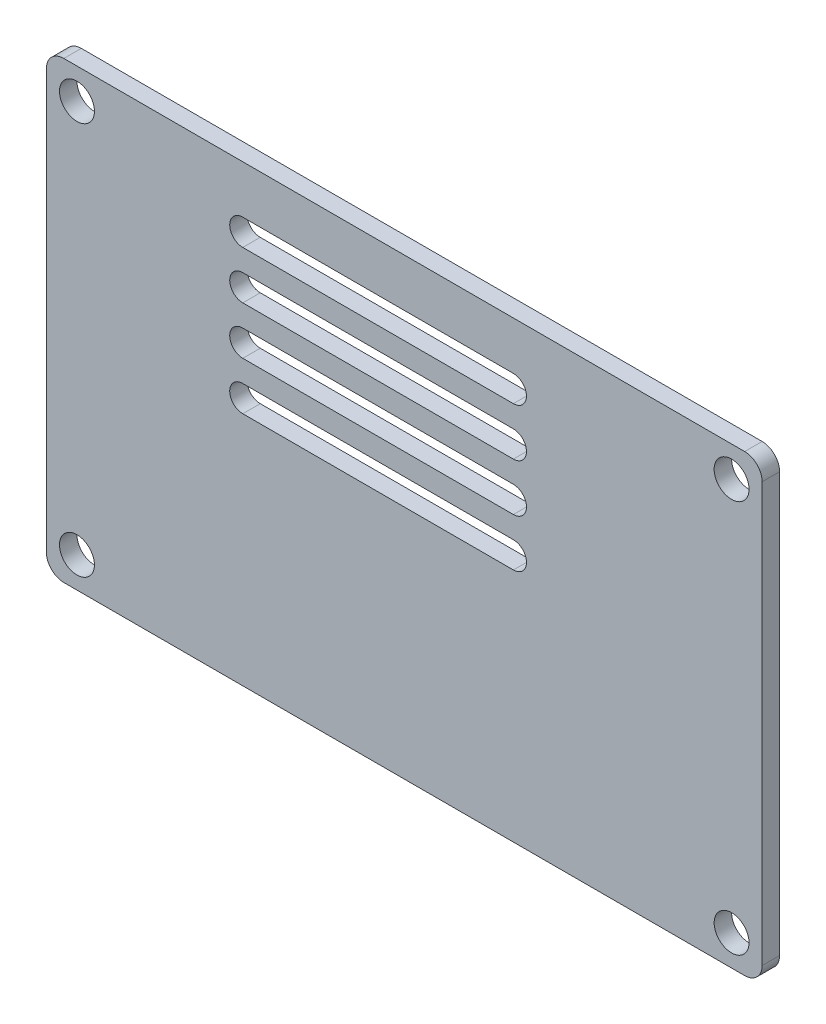
ISO-10303-21;
HEADER;
FILE_DESCRIPTION(('STEP AP214'),'2;1');
FILE_NAME('part.step','',(''),(''),'','','');
FILE_SCHEMA(('AUTOMOTIVE_DESIGN { 1 0 10303 214 1 1 1 1 }'));
ENDSEC;
DATA;
#1=APPLICATION_CONTEXT('core data for automotive mechanical design processes');
#2=APPLICATION_PROTOCOL_DEFINITION('international standard','automotive_design',2000,#1);
#3=PRODUCT_CONTEXT('',#1,'mechanical');
#4=PRODUCT('Part','Part','',(#3));
#5=PRODUCT_RELATED_PRODUCT_CATEGORY('part','',(#4));
#6=PRODUCT_DEFINITION_FORMATION('','',#4);
#7=PRODUCT_DEFINITION_CONTEXT('part definition',#1,'design');
#8=PRODUCT_DEFINITION('design','',#6,#7);
#9=PRODUCT_DEFINITION_SHAPE('','',#8);
#10=(LENGTH_UNIT() NAMED_UNIT(*) SI_UNIT(.MILLI.,.METRE.));
#11=(NAMED_UNIT(*) PLANE_ANGLE_UNIT() SI_UNIT($,.RADIAN.));
#12=(NAMED_UNIT(*) SI_UNIT($,.STERADIAN.) SOLID_ANGLE_UNIT());
#13=UNCERTAINTY_MEASURE_WITH_UNIT(LENGTH_MEASURE(1.E-05),#10,'distance_accuracy_value','');
#14=(GEOMETRIC_REPRESENTATION_CONTEXT(3) GLOBAL_UNCERTAINTY_ASSIGNED_CONTEXT((#13)) GLOBAL_UNIT_ASSIGNED_CONTEXT((#10,
#11,#12)) REPRESENTATION_CONTEXT('',''));
#15=CARTESIAN_POINT('',(0.,0.,0.));
#16=DIRECTION('',(0.,0.,1.));
#17=DIRECTION('',(1.,0.,0.));
#18=AXIS2_PLACEMENT_3D('',#15,#16,#17);
#19=CARTESIAN_POINT('',(-41.,-26.,2.));
#20=DIRECTION('',(1.,0.,0.));
#21=DIRECTION('',(0.,0.,-1.));
#22=AXIS2_PLACEMENT_3D('',#19,#20,#21);
#23=PLANE('',#22);
#24=DIRECTION('',(0.,-1.,0.));
#25=VECTOR('',#24,1.);
#26=CARTESIAN_POINT('',(-41.,-26.,0.));
#27=LINE('',#26,#25);
#28=CARTESIAN_POINT('',(-41.,24.,0.));
#29=VERTEX_POINT('',#28);
#30=CARTESIAN_POINT('',(-41.,-24.,0.));
#31=VERTEX_POINT('',#30);
#32=EDGE_CURVE('E323',#29,#31,#27,.T.);
#33=ORIENTED_EDGE('',*,*,#32,.T.);
#34=DIRECTION('',(0.,0.,-1.));
#35=VECTOR('',#34,1.);
#36=CARTESIAN_POINT('',(-41.,-24.,2.));
#37=LINE('',#36,#35);
#38=CARTESIAN_POINT('',(-41.,-24.,2.));
#39=VERTEX_POINT('',#38);
#40=EDGE_CURVE('E382',#31,#39,#37,.F.);
#41=ORIENTED_EDGE('',*,*,#40,.T.);
#42=DIRECTION('',(0.,-1.,0.));
#43=VECTOR('',#42,1.);
#44=CARTESIAN_POINT('',(-41.,-26.,2.));
#45=LINE('',#44,#43);
#46=CARTESIAN_POINT('',(-41.,24.,2.));
#47=VERTEX_POINT('',#46);
#48=EDGE_CURVE('E330',#47,#39,#45,.T.);
#49=ORIENTED_EDGE('',*,*,#48,.F.);
#50=DIRECTION('',(0.,0.,-1.));
#51=VECTOR('',#50,1.);
#52=CARTESIAN_POINT('',(-41.,24.,2.));
#53=LINE('',#52,#51);
#54=EDGE_CURVE('E379',#47,#29,#53,.T.);
#55=ORIENTED_EDGE('',*,*,#54,.T.);
#56=EDGE_LOOP('',(#33,#41,#49,#55));
#57=FACE_BOUND('',#56,.T.);
#58=ADVANCED_FACE('F32',(#57),#23,.F.);
#59=CARTESIAN_POINT('',(41.,-26.,2.));
#60=DIRECTION('',(0.,1.,0.));
#61=DIRECTION('',(-1.,0.,0.));
#62=AXIS2_PLACEMENT_3D('',#59,#60,#61);
#63=PLANE('',#62);
#64=DIRECTION('',(1.,0.,0.));
#65=VECTOR('',#64,1.);
#66=CARTESIAN_POINT('',(41.,-26.,0.));
#67=LINE('',#66,#65);
#68=CARTESIAN_POINT('',(-39.,-26.,0.));
#69=VERTEX_POINT('',#68);
#70=CARTESIAN_POINT('',(39.,-26.,0.));
#71=VERTEX_POINT('',#70);
#72=EDGE_CURVE('E346',#69,#71,#67,.T.);
#73=ORIENTED_EDGE('',*,*,#72,.T.);
#74=DIRECTION('',(0.,0.,-1.));
#75=VECTOR('',#74,1.);
#76=CARTESIAN_POINT('',(39.,-26.,2.));
#77=LINE('',#76,#75);
#78=CARTESIAN_POINT('',(39.,-26.,2.));
#79=VERTEX_POINT('',#78);
#80=EDGE_CURVE('E369',#71,#79,#77,.F.);
#81=ORIENTED_EDGE('',*,*,#80,.T.);
#82=DIRECTION('',(1.,0.,0.));
#83=VECTOR('',#82,1.);
#84=CARTESIAN_POINT('',(41.,-26.,2.));
#85=LINE('',#84,#83);
#86=CARTESIAN_POINT('',(-39.,-26.,2.));
#87=VERTEX_POINT('',#86);
#88=EDGE_CURVE('E333',#87,#79,#85,.T.);
#89=ORIENTED_EDGE('',*,*,#88,.F.);
#90=DIRECTION('',(0.,0.,-1.));
#91=VECTOR('',#90,1.);
#92=CARTESIAN_POINT('',(-39.,-26.,2.));
#93=LINE('',#92,#91);
#94=EDGE_CURVE('E366',#87,#69,#93,.T.);
#95=ORIENTED_EDGE('',*,*,#94,.T.);
#96=EDGE_LOOP('',(#73,#81,#89,#95));
#97=FACE_BOUND('',#96,.T.);
#98=ADVANCED_FACE('F411',(#97),#63,.F.);
#99=CARTESIAN_POINT('',(41.,-26.,2.));
#100=DIRECTION('',(-1.,0.,0.));
#101=DIRECTION('',(0.,0.,1.));
#102=AXIS2_PLACEMENT_3D('',#99,#100,#101);
#103=PLANE('',#102);
#104=DIRECTION('',(0.,1.,0.));
#105=VECTOR('',#104,1.);
#106=CARTESIAN_POINT('',(41.,-26.,2.));
#107=LINE('',#106,#105);
#108=CARTESIAN_POINT('',(41.,-24.,2.));
#109=VERTEX_POINT('',#108);
#110=CARTESIAN_POINT('',(41.,24.,2.));
#111=VERTEX_POINT('',#110);
#112=EDGE_CURVE('E337',#109,#111,#107,.T.);
#113=ORIENTED_EDGE('',*,*,#112,.F.);
#114=DIRECTION('',(0.,0.,-1.));
#115=VECTOR('',#114,1.);
#116=CARTESIAN_POINT('',(41.,-24.,2.));
#117=LINE('',#116,#115);
#118=CARTESIAN_POINT('',(41.,-24.,0.));
#119=VERTEX_POINT('',#118);
#120=EDGE_CURVE('E355',#109,#119,#117,.T.);
#121=ORIENTED_EDGE('',*,*,#120,.T.);
#122=DIRECTION('',(0.,1.,0.));
#123=VECTOR('',#122,1.);
#124=CARTESIAN_POINT('',(41.,-26.,0.));
#125=LINE('',#124,#123);
#126=CARTESIAN_POINT('',(41.,24.,0.));
#127=VERTEX_POINT('',#126);
#128=EDGE_CURVE('E349',#119,#127,#125,.T.);
#129=ORIENTED_EDGE('',*,*,#128,.T.);
#130=DIRECTION('',(0.,0.,-1.));
#131=VECTOR('',#130,1.);
#132=CARTESIAN_POINT('',(41.,24.,2.));
#133=LINE('',#132,#131);
#134=EDGE_CURVE('E343',#127,#111,#133,.F.);
#135=ORIENTED_EDGE('',*,*,#134,.T.);
#136=EDGE_LOOP('',(#113,#121,#129,#135));
#137=FACE_BOUND('',#136,.T.);
#138=ADVANCED_FACE('F419',(#137),#103,.F.);
#139=CARTESIAN_POINT('',(41.,26.,2.));
#140=DIRECTION('',(0.,-1.,0.));
#141=DIRECTION('',(1.,0.,0.));
#142=AXIS2_PLACEMENT_3D('',#139,#140,#141);
#143=PLANE('',#142);
#144=DIRECTION('',(-1.,0.,0.));
#145=VECTOR('',#144,1.);
#146=CARTESIAN_POINT('',(41.,26.,0.));
#147=LINE('',#146,#145);
#148=CARTESIAN_POINT('',(39.,26.,0.));
#149=VERTEX_POINT('',#148);
#150=CARTESIAN_POINT('',(-39.,26.,0.));
#151=VERTEX_POINT('',#150);
#152=EDGE_CURVE('E334',#149,#151,#147,.T.);
#153=ORIENTED_EDGE('',*,*,#152,.T.);
#154=DIRECTION('',(0.,0.,-1.));
#155=VECTOR('',#154,1.);
#156=CARTESIAN_POINT('',(-39.,26.,2.));
#157=LINE('',#156,#155);
#158=CARTESIAN_POINT('',(-39.,26.,2.));
#159=VERTEX_POINT('',#158);
#160=EDGE_CURVE('E11',#151,#159,#157,.F.);
#161=ORIENTED_EDGE('',*,*,#160,.T.);
#162=DIRECTION('',(-1.,0.,0.));
#163=VECTOR('',#162,1.);
#164=CARTESIAN_POINT('',(41.,26.,2.));
#165=LINE('',#164,#163);
#166=CARTESIAN_POINT('',(39.,26.,2.));
#167=VERTEX_POINT('',#166);
#168=EDGE_CURVE('E340',#167,#159,#165,.T.);
#169=ORIENTED_EDGE('',*,*,#168,.F.);
#170=DIRECTION('',(0.,0.,-1.));
#171=VECTOR('',#170,1.);
#172=CARTESIAN_POINT('',(39.,26.,2.));
#173=LINE('',#172,#171);
#174=EDGE_CURVE('E40',#167,#149,#173,.T.);
#175=ORIENTED_EDGE('',*,*,#174,.T.);
#176=EDGE_LOOP('',(#153,#161,#169,#175));
#177=FACE_BOUND('',#176,.T.);
#178=ADVANCED_FACE('F388',(#177),#143,.F.);
#179=CARTESIAN_POINT('',(0.,0.,2.));
#180=DIRECTION('',(0.,0.,1.));
#181=DIRECTION('',(1.,0.,0.));
#182=AXIS2_PLACEMENT_3D('',#179,#180,#181);
#183=PLANE('',#182);
#184=CARTESIAN_POINT('',(-37.5,22.5,2.));
#185=DIRECTION('',(0.,0.,1.));
#186=DIRECTION('',(1.,0.,0.));
#187=AXIS2_PLACEMENT_3D('',#184,#185,#186);
#188=CIRCLE('',#187,2.);
#189=CARTESIAN_POINT('',(-35.5,22.5,2.));
#190=VERTEX_POINT('',#189);
#191=EDGE_CURVE('E702',#190,#190,#188,.T.);
#192=ORIENTED_EDGE('',*,*,#191,.F.);
#193=EDGE_LOOP('',(#192));
#194=FACE_BOUND('',#193,.T.);
#195=CARTESIAN_POINT('',(37.5,-22.5,2.));
#196=DIRECTION('',(0.,0.,1.));
#197=DIRECTION('',(1.,0.,0.));
#198=AXIS2_PLACEMENT_3D('',#195,#196,#197);
#199=CIRCLE('',#198,2.);
#200=CARTESIAN_POINT('',(39.5,-22.5,2.));
#201=VERTEX_POINT('',#200);
#202=EDGE_CURVE('E707',#201,#201,#199,.T.);
#203=ORIENTED_EDGE('',*,*,#202,.F.);
#204=EDGE_LOOP('',(#203));
#205=FACE_BOUND('',#204,.T.);
#206=CARTESIAN_POINT('',(-37.5,-22.5,2.));
#207=DIRECTION('',(0.,0.,1.));
#208=DIRECTION('',(1.,0.,0.));
#209=AXIS2_PLACEMENT_3D('',#206,#207,#208);
#210=CIRCLE('',#209,2.);
#211=CARTESIAN_POINT('',(-35.5,-22.5,2.));
#212=VERTEX_POINT('',#211);
#213=EDGE_CURVE('E715',#212,#212,#210,.T.);
#214=ORIENTED_EDGE('',*,*,#213,.F.);
#215=EDGE_LOOP('',(#214));
#216=FACE_BOUND('',#215,.T.);
#217=CARTESIAN_POINT('',(37.5,22.5,2.));
#218=DIRECTION('',(0.,0.,1.));
#219=DIRECTION('',(1.,0.,0.));
#220=AXIS2_PLACEMENT_3D('',#217,#218,#219);
#221=CIRCLE('',#220,2.);
#222=CARTESIAN_POINT('',(39.5,22.5,2.));
#223=VERTEX_POINT('',#222);
#224=EDGE_CURVE('E219',#223,#223,#221,.T.);
#225=ORIENTED_EDGE('',*,*,#224,.F.);
#226=EDGE_LOOP('',(#225));
#227=FACE_BOUND('',#226,.T.);
#228=CARTESIAN_POINT('',(-18.4999999999999,13.5,2.));
#229=DIRECTION('',(0.,0.,1.));
#230=DIRECTION('',(1.,0.,0.));
#231=AXIS2_PLACEMENT_3D('',#228,#229,#230);
#232=CIRCLE('',#231,1.5);
#233=CARTESIAN_POINT('',(-18.4999999999999,15.,2.));
#234=VERTEX_POINT('',#233);
#235=CARTESIAN_POINT('',(-18.4999999999999,12.,2.));
#236=VERTEX_POINT('',#235);
#237=EDGE_CURVE('E47',#234,#236,#232,.T.);
#238=ORIENTED_EDGE('',*,*,#237,.F.);
#239=DIRECTION('',(-1.,0.,0.));
#240=VECTOR('',#239,1.);
#241=CARTESIAN_POINT('',(-18.4999999999999,15.,2.));
#242=LINE('',#241,#240);
#243=CARTESIAN_POINT('',(12.5000000000001,15.,2.));
#244=VERTEX_POINT('',#243);
#245=EDGE_CURVE('E213',#244,#234,#242,.T.);
#246=ORIENTED_EDGE('',*,*,#245,.F.);
#247=CARTESIAN_POINT('',(12.5000000000001,13.5,2.));
#248=DIRECTION('',(0.,0.,1.));
#249=DIRECTION('',(1.,0.,0.));
#250=AXIS2_PLACEMENT_3D('',#247,#248,#249);
#251=CIRCLE('',#250,1.5);
#252=CARTESIAN_POINT('',(12.5000000000001,12.,2.));
#253=VERTEX_POINT('',#252);
#254=EDGE_CURVE('E216',#253,#244,#251,.T.);
#255=ORIENTED_EDGE('',*,*,#254,.F.);
#256=DIRECTION('',(1.,0.,0.));
#257=VECTOR('',#256,1.);
#258=CARTESIAN_POINT('',(-18.4999999999999,12.,2.));
#259=LINE('',#258,#257);
#260=EDGE_CURVE('E225',#236,#253,#259,.T.);
#261=ORIENTED_EDGE('',*,*,#260,.F.);
#262=EDGE_LOOP('',(#238,#246,#255,#261));
#263=FACE_BOUND('',#262,.T.);
#264=CARTESIAN_POINT('',(-18.4999999999997,8.,2.));
#265=DIRECTION('',(0.,0.,1.));
#266=DIRECTION('',(1.,0.,0.));
#267=AXIS2_PLACEMENT_3D('',#264,#265,#266);
#268=CIRCLE('',#267,1.5);
#269=CARTESIAN_POINT('',(-18.4999999999997,9.49999999999999,2.));
#270=VERTEX_POINT('',#269);
#271=CARTESIAN_POINT('',(-18.4999999999997,6.5,2.));
#272=VERTEX_POINT('',#271);
#273=EDGE_CURVE('E55',#270,#272,#268,.T.);
#274=ORIENTED_EDGE('',*,*,#273,.F.);
#275=DIRECTION('',(-1.,0.,0.));
#276=VECTOR('',#275,1.);
#277=CARTESIAN_POINT('',(-18.4999999999997,9.49999999999999,2.));
#278=LINE('',#277,#276);
#279=CARTESIAN_POINT('',(12.5000000000003,9.49999999999999,2.));
#280=VERTEX_POINT('',#279);
#281=EDGE_CURVE('E240',#280,#270,#278,.T.);
#282=ORIENTED_EDGE('',*,*,#281,.F.);
#283=CARTESIAN_POINT('',(12.5000000000003,8.,2.));
#284=DIRECTION('',(0.,0.,1.));
#285=DIRECTION('',(1.,0.,0.));
#286=AXIS2_PLACEMENT_3D('',#283,#284,#285);
#287=CIRCLE('',#286,1.5);
#288=CARTESIAN_POINT('',(12.5000000000003,6.5,2.));
#289=VERTEX_POINT('',#288);
#290=EDGE_CURVE('E255',#289,#280,#287,.T.);
#291=ORIENTED_EDGE('',*,*,#290,.F.);
#292=DIRECTION('',(1.,0.,0.));
#293=VECTOR('',#292,1.);
#294=CARTESIAN_POINT('',(-18.4999999999997,6.5,2.));
#295=LINE('',#294,#293);
#296=EDGE_CURVE('E251',#272,#289,#295,.T.);
#297=ORIENTED_EDGE('',*,*,#296,.F.);
#298=EDGE_LOOP('',(#274,#282,#291,#297));
#299=FACE_BOUND('',#298,.T.);
#300=CARTESIAN_POINT('',(-18.4999999999996,2.5,2.));
#301=DIRECTION('',(0.,0.,1.));
#302=DIRECTION('',(1.,0.,0.));
#303=AXIS2_PLACEMENT_3D('',#300,#301,#302);
#304=CIRCLE('',#303,1.5);
#305=CARTESIAN_POINT('',(-18.4999999999996,3.99999999999999,2.));
#306=VERTEX_POINT('',#305);
#307=CARTESIAN_POINT('',(-18.4999999999996,0.999999999999997,2.));
#308=VERTEX_POINT('',#307);
#309=EDGE_CURVE('E280',#306,#308,#304,.T.);
#310=ORIENTED_EDGE('',*,*,#309,.F.);
#311=DIRECTION('',(-1.,0.,0.));
#312=VECTOR('',#311,1.);
#313=CARTESIAN_POINT('',(-18.4999999999996,3.99999999999999,2.));
#314=LINE('',#313,#312);
#315=CARTESIAN_POINT('',(12.5000000000004,3.99999999999999,2.));
#316=VERTEX_POINT('',#315);
#317=EDGE_CURVE('E270',#316,#306,#314,.T.);
#318=ORIENTED_EDGE('',*,*,#317,.F.);
#319=CARTESIAN_POINT('',(12.5000000000004,2.5,2.));
#320=DIRECTION('',(0.,0.,1.));
#321=DIRECTION('',(1.,0.,0.));
#322=AXIS2_PLACEMENT_3D('',#319,#320,#321);
#323=CIRCLE('',#322,1.5);
#324=CARTESIAN_POINT('',(12.5000000000004,0.999999999999997,2.));
#325=VERTEX_POINT('',#324);
#326=EDGE_CURVE('E286',#325,#316,#323,.T.);
#327=ORIENTED_EDGE('',*,*,#326,.F.);
#328=DIRECTION('',(1.,0.,0.));
#329=VECTOR('',#328,1.);
#330=CARTESIAN_POINT('',(-18.4999999999996,0.999999999999997,2.));
#331=LINE('',#330,#329);
#332=EDGE_CURVE('E282',#308,#325,#331,.T.);
#333=ORIENTED_EDGE('',*,*,#332,.F.);
#334=EDGE_LOOP('',(#310,#318,#327,#333));
#335=FACE_BOUND('',#334,.T.);
#336=CARTESIAN_POINT('',(-18.5,19.,2.));
#337=DIRECTION('',(0.,0.,1.));
#338=DIRECTION('',(1.,0.,0.));
#339=AXIS2_PLACEMENT_3D('',#336,#337,#338);
#340=CIRCLE('',#339,1.5);
#341=CARTESIAN_POINT('',(-18.5,20.5,2.));
#342=VERTEX_POINT('',#341);
#343=CARTESIAN_POINT('',(-18.5,17.5,2.));
#344=VERTEX_POINT('',#343);
#345=EDGE_CURVE('E232',#342,#344,#340,.T.);
#346=ORIENTED_EDGE('',*,*,#345,.F.);
#347=DIRECTION('',(-1.,0.,0.));
#348=VECTOR('',#347,1.);
#349=CARTESIAN_POINT('',(-18.5,20.5,2.));
#350=LINE('',#349,#348);
#351=CARTESIAN_POINT('',(12.5,20.5,2.));
#352=VERTEX_POINT('',#351);
#353=EDGE_CURVE('E302',#352,#342,#350,.T.);
#354=ORIENTED_EDGE('',*,*,#353,.F.);
#355=CARTESIAN_POINT('',(12.5,19.,2.));
#356=DIRECTION('',(0.,0.,1.));
#357=DIRECTION('',(1.,0.,0.));
#358=AXIS2_PLACEMENT_3D('',#355,#356,#357);
#359=CIRCLE('',#358,1.5);
#360=CARTESIAN_POINT('',(12.5,17.5,2.));
#361=VERTEX_POINT('',#360);
#362=EDGE_CURVE('E316',#361,#352,#359,.T.);
#363=ORIENTED_EDGE('',*,*,#362,.F.);
#364=DIRECTION('',(1.,0.,0.));
#365=VECTOR('',#364,1.);
#366=CARTESIAN_POINT('',(-18.5,17.5,2.));
#367=LINE('',#366,#365);
#368=EDGE_CURVE('E313',#344,#361,#367,.T.);
#369=ORIENTED_EDGE('',*,*,#368,.F.);
#370=EDGE_LOOP('',(#346,#354,#363,#369));
#371=FACE_BOUND('',#370,.T.);
#372=ORIENTED_EDGE('',*,*,#88,.T.);
#373=CARTESIAN_POINT('',(39.,-24.,2.));
#374=DIRECTION('',(0.,0.,1.));
#375=DIRECTION('',(1.,0.,0.));
#376=AXIS2_PLACEMENT_3D('',#373,#374,#375);
#377=CIRCLE('',#376,2.);
#378=EDGE_CURVE('E377',#79,#109,#377,.T.);
#379=ORIENTED_EDGE('',*,*,#378,.T.);
#380=ORIENTED_EDGE('',*,*,#112,.T.);
#381=CARTESIAN_POINT('',(39.,24.,2.));
#382=DIRECTION('',(0.,0.,1.));
#383=DIRECTION('',(1.,0.,0.));
#384=AXIS2_PLACEMENT_3D('',#381,#382,#383);
#385=CIRCLE('',#384,2.);
#386=EDGE_CURVE('E371',#111,#167,#385,.T.);
#387=ORIENTED_EDGE('',*,*,#386,.T.);
#388=ORIENTED_EDGE('',*,*,#168,.T.);
#389=CARTESIAN_POINT('',(-39.,24.,2.));
#390=DIRECTION('',(0.,0.,1.));
#391=DIRECTION('',(1.,0.,0.));
#392=AXIS2_PLACEMENT_3D('',#389,#390,#391);
#393=CIRCLE('',#392,2.);
#394=EDGE_CURVE('E373',#159,#47,#393,.T.);
#395=ORIENTED_EDGE('',*,*,#394,.T.);
#396=ORIENTED_EDGE('',*,*,#48,.T.);
#397=CARTESIAN_POINT('',(-39.,-24.,2.));
#398=DIRECTION('',(0.,0.,1.));
#399=DIRECTION('',(1.,0.,0.));
#400=AXIS2_PLACEMENT_3D('',#397,#398,#399);
#401=CIRCLE('',#400,2.);
#402=EDGE_CURVE('E375',#39,#87,#401,.T.);
#403=ORIENTED_EDGE('',*,*,#402,.T.);
#404=EDGE_LOOP('',(#372,#379,#380,#387,#388,#395,#396,#403));
#405=FACE_BOUND('',#404,.T.);
#406=ADVANCED_FACE('F404',(#194,#205,#216,#227,#263,#299,#335,#371,#405),#183,.T.);
#407=CARTESIAN_POINT('',(0.,0.,0.));
#408=DIRECTION('',(0.,0.,1.));
#409=DIRECTION('',(1.,0.,0.));
#410=AXIS2_PLACEMENT_3D('',#407,#408,#409);
#411=PLANE('',#410);
#412=CARTESIAN_POINT('',(-37.5,22.5,0.));
#413=DIRECTION('',(0.,0.,1.));
#414=DIRECTION('',(1.,0.,0.));
#415=AXIS2_PLACEMENT_3D('',#412,#413,#414);
#416=CIRCLE('',#415,2.);
#417=CARTESIAN_POINT('',(-35.5,22.5,0.));
#418=VERTEX_POINT('',#417);
#419=EDGE_CURVE('E699',#418,#418,#416,.T.);
#420=ORIENTED_EDGE('',*,*,#419,.T.);
#421=EDGE_LOOP('',(#420));
#422=FACE_BOUND('',#421,.T.);
#423=CARTESIAN_POINT('',(37.5,-22.5,0.));
#424=DIRECTION('',(0.,0.,1.));
#425=DIRECTION('',(1.,0.,0.));
#426=AXIS2_PLACEMENT_3D('',#423,#424,#425);
#427=CIRCLE('',#426,2.);
#428=CARTESIAN_POINT('',(39.5,-22.5,0.));
#429=VERTEX_POINT('',#428);
#430=EDGE_CURVE('E703',#429,#429,#427,.T.);
#431=ORIENTED_EDGE('',*,*,#430,.T.);
#432=EDGE_LOOP('',(#431));
#433=FACE_BOUND('',#432,.T.);
#434=CARTESIAN_POINT('',(-37.5,-22.5,0.));
#435=DIRECTION('',(0.,0.,1.));
#436=DIRECTION('',(1.,0.,0.));
#437=AXIS2_PLACEMENT_3D('',#434,#435,#436);
#438=CIRCLE('',#437,2.);
#439=CARTESIAN_POINT('',(-35.5,-22.5,0.));
#440=VERTEX_POINT('',#439);
#441=EDGE_CURVE('E712',#440,#440,#438,.T.);
#442=ORIENTED_EDGE('',*,*,#441,.T.);
#443=EDGE_LOOP('',(#442));
#444=FACE_BOUND('',#443,.T.);
#445=CARTESIAN_POINT('',(37.5,22.5,0.));
#446=DIRECTION('',(0.,0.,1.));
#447=DIRECTION('',(1.,0.,0.));
#448=AXIS2_PLACEMENT_3D('',#445,#446,#447);
#449=CIRCLE('',#448,2.);
#450=CARTESIAN_POINT('',(39.5,22.5,0.));
#451=VERTEX_POINT('',#450);
#452=EDGE_CURVE('E283',#451,#451,#449,.T.);
#453=ORIENTED_EDGE('',*,*,#452,.T.);
#454=EDGE_LOOP('',(#453));
#455=FACE_BOUND('',#454,.T.);
#456=DIRECTION('',(-1.,0.,0.));
#457=VECTOR('',#456,1.);
#458=CARTESIAN_POINT('',(-18.4999999999999,15.,0.));
#459=LINE('',#458,#457);
#460=CARTESIAN_POINT('',(12.5000000000001,15.,0.));
#461=VERTEX_POINT('',#460);
#462=CARTESIAN_POINT('',(-18.4999999999999,15.,0.));
#463=VERTEX_POINT('',#462);
#464=EDGE_CURVE('E200',#461,#463,#459,.T.);
#465=ORIENTED_EDGE('',*,*,#464,.T.);
#466=CARTESIAN_POINT('',(-18.4999999999999,13.5,0.));
#467=DIRECTION('',(0.,0.,1.));
#468=DIRECTION('',(1.,0.,0.));
#469=AXIS2_PLACEMENT_3D('',#466,#467,#468);
#470=CIRCLE('',#469,1.5);
#471=CARTESIAN_POINT('',(-18.4999999999999,12.,0.));
#472=VERTEX_POINT('',#471);
#473=EDGE_CURVE('E194',#463,#472,#470,.T.);
#474=ORIENTED_EDGE('',*,*,#473,.T.);
#475=DIRECTION('',(1.,0.,0.));
#476=VECTOR('',#475,1.);
#477=CARTESIAN_POINT('',(-18.4999999999999,12.,0.));
#478=LINE('',#477,#476);
#479=CARTESIAN_POINT('',(12.5000000000001,12.,0.));
#480=VERTEX_POINT('',#479);
#481=EDGE_CURVE('E204',#472,#480,#478,.T.);
#482=ORIENTED_EDGE('',*,*,#481,.T.);
#483=CARTESIAN_POINT('',(12.5000000000001,13.5,0.));
#484=DIRECTION('',(0.,0.,1.));
#485=DIRECTION('',(1.,0.,0.));
#486=AXIS2_PLACEMENT_3D('',#483,#484,#485);
#487=CIRCLE('',#486,1.5);
#488=EDGE_CURVE('E208',#480,#461,#487,.T.);
#489=ORIENTED_EDGE('',*,*,#488,.T.);
#490=EDGE_LOOP('',(#465,#474,#482,#489));
#491=FACE_BOUND('',#490,.T.);
#492=DIRECTION('',(-1.,0.,0.));
#493=VECTOR('',#492,1.);
#494=CARTESIAN_POINT('',(-18.4999999999997,9.49999999999999,0.));
#495=LINE('',#494,#493);
#496=CARTESIAN_POINT('',(12.5000000000003,9.49999999999999,0.));
#497=VERTEX_POINT('',#496);
#498=CARTESIAN_POINT('',(-18.4999999999997,9.49999999999999,0.));
#499=VERTEX_POINT('',#498);
#500=EDGE_CURVE('E246',#497,#499,#495,.T.);
#501=ORIENTED_EDGE('',*,*,#500,.T.);
#502=CARTESIAN_POINT('',(-18.4999999999997,8.,0.));
#503=DIRECTION('',(0.,0.,1.));
#504=DIRECTION('',(1.,0.,0.));
#505=AXIS2_PLACEMENT_3D('',#502,#503,#504);
#506=CIRCLE('',#505,1.5);
#507=CARTESIAN_POINT('',(-18.4999999999997,6.5,0.));
#508=VERTEX_POINT('',#507);
#509=EDGE_CURVE('E236',#499,#508,#506,.T.);
#510=ORIENTED_EDGE('',*,*,#509,.T.);
#511=DIRECTION('',(1.,0.,0.));
#512=VECTOR('',#511,1.);
#513=CARTESIAN_POINT('',(-18.4999999999997,6.5,0.));
#514=LINE('',#513,#512);
#515=CARTESIAN_POINT('',(12.5000000000003,6.5,0.));
#516=VERTEX_POINT('',#515);
#517=EDGE_CURVE('E239',#508,#516,#514,.T.);
#518=ORIENTED_EDGE('',*,*,#517,.T.);
#519=CARTESIAN_POINT('',(12.5000000000003,8.,0.));
#520=DIRECTION('',(0.,0.,1.));
#521=DIRECTION('',(1.,0.,0.));
#522=AXIS2_PLACEMENT_3D('',#519,#520,#521);
#523=CIRCLE('',#522,1.5);
#524=EDGE_CURVE('E243',#516,#497,#523,.T.);
#525=ORIENTED_EDGE('',*,*,#524,.T.);
#526=EDGE_LOOP('',(#501,#510,#518,#525));
#527=FACE_BOUND('',#526,.T.);
#528=DIRECTION('',(-1.,0.,0.));
#529=VECTOR('',#528,1.);
#530=CARTESIAN_POINT('',(-18.4999999999996,3.99999999999999,0.));
#531=LINE('',#530,#529);
#532=CARTESIAN_POINT('',(12.5000000000004,3.99999999999999,0.));
#533=VERTEX_POINT('',#532);
#534=CARTESIAN_POINT('',(-18.4999999999996,3.99999999999999,0.));
#535=VERTEX_POINT('',#534);
#536=EDGE_CURVE('E276',#533,#535,#531,.T.);
#537=ORIENTED_EDGE('',*,*,#536,.T.);
#538=CARTESIAN_POINT('',(-18.4999999999996,2.5,0.));
#539=DIRECTION('',(0.,0.,1.));
#540=DIRECTION('',(1.,0.,0.));
#541=AXIS2_PLACEMENT_3D('',#538,#539,#540);
#542=CIRCLE('',#541,1.5);
#543=CARTESIAN_POINT('',(-18.4999999999996,0.999999999999997,0.));
#544=VERTEX_POINT('',#543);
#545=EDGE_CURVE('E266',#535,#544,#542,.T.);
#546=ORIENTED_EDGE('',*,*,#545,.T.);
#547=DIRECTION('',(1.,0.,0.));
#548=VECTOR('',#547,1.);
#549=CARTESIAN_POINT('',(-18.4999999999996,0.999999999999997,0.));
#550=LINE('',#549,#548);
#551=CARTESIAN_POINT('',(12.5000000000004,0.999999999999997,0.));
#552=VERTEX_POINT('',#551);
#553=EDGE_CURVE('E269',#544,#552,#550,.T.);
#554=ORIENTED_EDGE('',*,*,#553,.T.);
#555=CARTESIAN_POINT('',(12.5000000000004,2.5,0.));
#556=DIRECTION('',(0.,0.,1.));
#557=DIRECTION('',(1.,0.,0.));
#558=AXIS2_PLACEMENT_3D('',#555,#556,#557);
#559=CIRCLE('',#558,1.5);
#560=EDGE_CURVE('E273',#552,#533,#559,.T.);
#561=ORIENTED_EDGE('',*,*,#560,.T.);
#562=EDGE_LOOP('',(#537,#546,#554,#561));
#563=FACE_BOUND('',#562,.T.);
#564=DIRECTION('',(-1.,0.,0.));
#565=VECTOR('',#564,1.);
#566=CARTESIAN_POINT('',(-18.5,20.5,0.));
#567=LINE('',#566,#565);
#568=CARTESIAN_POINT('',(12.5,20.5,0.));
#569=VERTEX_POINT('',#568);
#570=CARTESIAN_POINT('',(-18.5,20.5,0.));
#571=VERTEX_POINT('',#570);
#572=EDGE_CURVE('E308',#569,#571,#567,.T.);
#573=ORIENTED_EDGE('',*,*,#572,.T.);
#574=CARTESIAN_POINT('',(-18.5,19.,0.));
#575=DIRECTION('',(0.,0.,1.));
#576=DIRECTION('',(1.,0.,0.));
#577=AXIS2_PLACEMENT_3D('',#574,#575,#576);
#578=CIRCLE('',#577,1.5);
#579=CARTESIAN_POINT('',(-18.5,17.5,0.));
#580=VERTEX_POINT('',#579);
#581=EDGE_CURVE('E298',#571,#580,#578,.T.);
#582=ORIENTED_EDGE('',*,*,#581,.T.);
#583=DIRECTION('',(1.,0.,0.));
#584=VECTOR('',#583,1.);
#585=CARTESIAN_POINT('',(-18.5,17.5,0.));
#586=LINE('',#585,#584);
#587=CARTESIAN_POINT('',(12.5,17.5,0.));
#588=VERTEX_POINT('',#587);
#589=EDGE_CURVE('E301',#580,#588,#586,.T.);
#590=ORIENTED_EDGE('',*,*,#589,.T.);
#591=CARTESIAN_POINT('',(12.5,19.,0.));
#592=DIRECTION('',(0.,0.,1.));
#593=DIRECTION('',(1.,0.,0.));
#594=AXIS2_PLACEMENT_3D('',#591,#592,#593);
#595=CIRCLE('',#594,1.5);
#596=EDGE_CURVE('E305',#588,#569,#595,.T.);
#597=ORIENTED_EDGE('',*,*,#596,.T.);
#598=EDGE_LOOP('',(#573,#582,#590,#597));
#599=FACE_BOUND('',#598,.T.);
#600=ORIENTED_EDGE('',*,*,#128,.F.);
#601=CARTESIAN_POINT('',(39.,-24.,0.));
#602=DIRECTION('',(0.,0.,1.));
#603=DIRECTION('',(1.,0.,0.));
#604=AXIS2_PLACEMENT_3D('',#601,#602,#603);
#605=CIRCLE('',#604,2.);
#606=EDGE_CURVE('E364',#119,#71,#605,.F.);
#607=ORIENTED_EDGE('',*,*,#606,.T.);
#608=ORIENTED_EDGE('',*,*,#72,.F.);
#609=CARTESIAN_POINT('',(-39.,-24.,0.));
#610=DIRECTION('',(0.,0.,1.));
#611=DIRECTION('',(1.,0.,0.));
#612=AXIS2_PLACEMENT_3D('',#609,#610,#611);
#613=CIRCLE('',#612,2.);
#614=EDGE_CURVE('E362',#69,#31,#613,.F.);
#615=ORIENTED_EDGE('',*,*,#614,.T.);
#616=ORIENTED_EDGE('',*,*,#32,.F.);
#617=CARTESIAN_POINT('',(-39.,24.,0.));
#618=DIRECTION('',(0.,0.,1.));
#619=DIRECTION('',(1.,0.,0.));
#620=AXIS2_PLACEMENT_3D('',#617,#618,#619);
#621=CIRCLE('',#620,2.);
#622=EDGE_CURVE('E360',#29,#151,#621,.F.);
#623=ORIENTED_EDGE('',*,*,#622,.T.);
#624=ORIENTED_EDGE('',*,*,#152,.F.);
#625=CARTESIAN_POINT('',(39.,24.,0.));
#626=DIRECTION('',(0.,0.,1.));
#627=DIRECTION('',(1.,0.,0.));
#628=AXIS2_PLACEMENT_3D('',#625,#626,#627);
#629=CIRCLE('',#628,2.);
#630=EDGE_CURVE('E358',#149,#127,#629,.F.);
#631=ORIENTED_EDGE('',*,*,#630,.T.);
#632=EDGE_LOOP('',(#600,#607,#608,#615,#616,#623,#624,#631));
#633=FACE_BOUND('',#632,.T.);
#634=ADVANCED_FACE('F210',(#422,#433,#444,#455,#491,#527,#563,#599,#633),#411,.F.);
#635=CARTESIAN_POINT('',(39.,-24.,2.));
#636=DIRECTION('',(0.,0.,-1.));
#637=DIRECTION('',(-1.,0.,0.));
#638=AXIS2_PLACEMENT_3D('',#635,#636,#637);
#639=CYLINDRICAL_SURFACE('',#638,2.);
#640=ORIENTED_EDGE('',*,*,#378,.F.);
#641=ORIENTED_EDGE('',*,*,#80,.F.);
#642=ORIENTED_EDGE('',*,*,#606,.F.);
#643=ORIENTED_EDGE('',*,*,#120,.F.);
#644=EDGE_LOOP('',(#640,#641,#642,#643));
#645=FACE_BOUND('',#644,.T.);
#646=ADVANCED_FACE('F416',(#645),#639,.T.);
#647=CARTESIAN_POINT('',(-39.,-24.,2.));
#648=DIRECTION('',(0.,0.,-1.));
#649=DIRECTION('',(-1.,0.,0.));
#650=AXIS2_PLACEMENT_3D('',#647,#648,#649);
#651=CYLINDRICAL_SURFACE('',#650,2.);
#652=ORIENTED_EDGE('',*,*,#402,.F.);
#653=ORIENTED_EDGE('',*,*,#40,.F.);
#654=ORIENTED_EDGE('',*,*,#614,.F.);
#655=ORIENTED_EDGE('',*,*,#94,.F.);
#656=EDGE_LOOP('',(#652,#653,#654,#655));
#657=FACE_BOUND('',#656,.T.);
#658=ADVANCED_FACE('F408',(#657),#651,.T.);
#659=CARTESIAN_POINT('',(-39.,24.,2.));
#660=DIRECTION('',(0.,0.,-1.));
#661=DIRECTION('',(-1.,0.,0.));
#662=AXIS2_PLACEMENT_3D('',#659,#660,#661);
#663=CYLINDRICAL_SURFACE('',#662,2.);
#664=ORIENTED_EDGE('',*,*,#394,.F.);
#665=ORIENTED_EDGE('',*,*,#160,.F.);
#666=ORIENTED_EDGE('',*,*,#622,.F.);
#667=ORIENTED_EDGE('',*,*,#54,.F.);
#668=EDGE_LOOP('',(#664,#665,#666,#667));
#669=FACE_BOUND('',#668,.T.);
#670=ADVANCED_FACE('F398',(#669),#663,.T.);
#671=CARTESIAN_POINT('',(39.,24.,2.));
#672=DIRECTION('',(0.,0.,-1.));
#673=DIRECTION('',(-1.,0.,0.));
#674=AXIS2_PLACEMENT_3D('',#671,#672,#673);
#675=CYLINDRICAL_SURFACE('',#674,2.);
#676=ORIENTED_EDGE('',*,*,#386,.F.);
#677=ORIENTED_EDGE('',*,*,#134,.F.);
#678=ORIENTED_EDGE('',*,*,#630,.F.);
#679=ORIENTED_EDGE('',*,*,#174,.F.);
#680=EDGE_LOOP('',(#676,#677,#678,#679));
#681=FACE_BOUND('',#680,.T.);
#682=ADVANCED_FACE('F34',(#681),#675,.T.);
#683=CARTESIAN_POINT('',(-18.5,19.,0.));
#684=DIRECTION('',(0.,0.,1.));
#685=DIRECTION('',(1.,0.,0.));
#686=AXIS2_PLACEMENT_3D('',#683,#684,#685);
#687=CYLINDRICAL_SURFACE('',#686,1.5);
#688=ORIENTED_EDGE('',*,*,#345,.T.);
#689=DIRECTION('',(0.,0.,1.));
#690=VECTOR('',#689,1.);
#691=CARTESIAN_POINT('',(-18.5,17.5,0.));
#692=LINE('',#691,#690);
#693=EDGE_CURVE('E311',#580,#344,#692,.T.);
#694=ORIENTED_EDGE('',*,*,#693,.F.);
#695=ORIENTED_EDGE('',*,*,#581,.F.);
#696=DIRECTION('',(0.,0.,1.));
#697=VECTOR('',#696,1.);
#698=CARTESIAN_POINT('',(-18.5,20.5,0.));
#699=LINE('',#698,#697);
#700=EDGE_CURVE('E321',#571,#342,#699,.T.);
#701=ORIENTED_EDGE('',*,*,#700,.T.);
#702=EDGE_LOOP('',(#688,#694,#695,#701));
#703=FACE_BOUND('',#702,.T.);
#704=ADVANCED_FACE('F422',(#703),#687,.F.);
#705=CARTESIAN_POINT('',(-18.5,20.5,0.));
#706=DIRECTION('',(0.,1.,0.));
#707=DIRECTION('',(0.,0.,1.));
#708=AXIS2_PLACEMENT_3D('',#705,#706,#707);
#709=PLANE('',#708);
#710=ORIENTED_EDGE('',*,*,#353,.T.);
#711=ORIENTED_EDGE('',*,*,#700,.F.);
#712=ORIENTED_EDGE('',*,*,#572,.F.);
#713=DIRECTION('',(0.,0.,1.));
#714=VECTOR('',#713,1.);
#715=CARTESIAN_POINT('',(12.5,20.5,0.));
#716=LINE('',#715,#714);
#717=EDGE_CURVE('E324',#569,#352,#716,.T.);
#718=ORIENTED_EDGE('',*,*,#717,.T.);
#719=EDGE_LOOP('',(#710,#711,#712,#718));
#720=FACE_BOUND('',#719,.T.);
#721=ADVANCED_FACE('F427',(#720),#709,.F.);
#722=CARTESIAN_POINT('',(12.5,19.,0.));
#723=DIRECTION('',(0.,0.,1.));
#724=DIRECTION('',(1.,0.,0.));
#725=AXIS2_PLACEMENT_3D('',#722,#723,#724);
#726=CYLINDRICAL_SURFACE('',#725,1.5);
#727=ORIENTED_EDGE('',*,*,#362,.T.);
#728=ORIENTED_EDGE('',*,*,#717,.F.);
#729=ORIENTED_EDGE('',*,*,#596,.F.);
#730=DIRECTION('',(0.,0.,1.));
#731=VECTOR('',#730,1.);
#732=CARTESIAN_POINT('',(12.5,17.5,0.));
#733=LINE('',#732,#731);
#734=EDGE_CURVE('E326',#588,#361,#733,.T.);
#735=ORIENTED_EDGE('',*,*,#734,.T.);
#736=EDGE_LOOP('',(#727,#728,#729,#735));
#737=FACE_BOUND('',#736,.T.);
#738=ADVANCED_FACE('F469',(#737),#726,.F.);
#739=CARTESIAN_POINT('',(-18.5,17.5,0.));
#740=DIRECTION('',(0.,-1.,0.));
#741=DIRECTION('',(0.,0.,-1.));
#742=AXIS2_PLACEMENT_3D('',#739,#740,#741);
#743=PLANE('',#742);
#744=ORIENTED_EDGE('',*,*,#368,.T.);
#745=ORIENTED_EDGE('',*,*,#734,.F.);
#746=ORIENTED_EDGE('',*,*,#589,.F.);
#747=ORIENTED_EDGE('',*,*,#693,.T.);
#748=EDGE_LOOP('',(#744,#745,#746,#747));
#749=FACE_BOUND('',#748,.T.);
#750=ADVANCED_FACE('F479',(#749),#743,.F.);
#751=CARTESIAN_POINT('',(-18.4999999999996,2.5,0.));
#752=DIRECTION('',(0.,0.,1.));
#753=DIRECTION('',(1.,0.,0.));
#754=AXIS2_PLACEMENT_3D('',#751,#752,#753);
#755=CYLINDRICAL_SURFACE('',#754,1.5);
#756=ORIENTED_EDGE('',*,*,#309,.T.);
#757=DIRECTION('',(0.,0.,1.));
#758=VECTOR('',#757,1.);
#759=CARTESIAN_POINT('',(-18.4999999999996,0.999999999999997,0.));
#760=LINE('',#759,#758);
#761=EDGE_CURVE('E279',#544,#308,#760,.T.);
#762=ORIENTED_EDGE('',*,*,#761,.F.);
#763=ORIENTED_EDGE('',*,*,#545,.F.);
#764=DIRECTION('',(0.,0.,1.));
#765=VECTOR('',#764,1.);
#766=CARTESIAN_POINT('',(-18.4999999999996,3.99999999999999,0.));
#767=LINE('',#766,#765);
#768=EDGE_CURVE('E252',#535,#306,#767,.T.);
#769=ORIENTED_EDGE('',*,*,#768,.T.);
#770=EDGE_LOOP('',(#756,#762,#763,#769));
#771=FACE_BOUND('',#770,.T.);
#772=ADVANCED_FACE('F489',(#771),#755,.F.);
#773=CARTESIAN_POINT('',(-18.4999999999996,3.99999999999999,0.));
#774=DIRECTION('',(0.,1.,0.));
#775=DIRECTION('',(0.,0.,1.));
#776=AXIS2_PLACEMENT_3D('',#773,#774,#775);
#777=PLANE('',#776);
#778=ORIENTED_EDGE('',*,*,#317,.T.);
#779=ORIENTED_EDGE('',*,*,#768,.F.);
#780=ORIENTED_EDGE('',*,*,#536,.F.);
#781=DIRECTION('',(0.,0.,1.));
#782=VECTOR('',#781,1.);
#783=CARTESIAN_POINT('',(12.5000000000004,3.99999999999999,0.));
#784=LINE('',#783,#782);
#785=EDGE_CURVE('E292',#533,#316,#784,.T.);
#786=ORIENTED_EDGE('',*,*,#785,.T.);
#787=EDGE_LOOP('',(#778,#779,#780,#786));
#788=FACE_BOUND('',#787,.T.);
#789=ADVANCED_FACE('F499',(#788),#777,.F.);
#790=CARTESIAN_POINT('',(12.5000000000004,2.5,0.));
#791=DIRECTION('',(0.,0.,1.));
#792=DIRECTION('',(1.,0.,0.));
#793=AXIS2_PLACEMENT_3D('',#790,#791,#792);
#794=CYLINDRICAL_SURFACE('',#793,1.5);
#795=ORIENTED_EDGE('',*,*,#326,.T.);
#796=ORIENTED_EDGE('',*,*,#785,.F.);
#797=ORIENTED_EDGE('',*,*,#560,.F.);
#798=DIRECTION('',(0.,0.,1.));
#799=VECTOR('',#798,1.);
#800=CARTESIAN_POINT('',(12.5000000000004,0.999999999999997,0.));
#801=LINE('',#800,#799);
#802=EDGE_CURVE('E294',#552,#325,#801,.T.);
#803=ORIENTED_EDGE('',*,*,#802,.T.);
#804=EDGE_LOOP('',(#795,#796,#797,#803));
#805=FACE_BOUND('',#804,.T.);
#806=ADVANCED_FACE('F509',(#805),#794,.F.);
#807=CARTESIAN_POINT('',(-18.4999999999996,0.999999999999997,0.));
#808=DIRECTION('',(0.,-1.,0.));
#809=DIRECTION('',(0.,0.,-1.));
#810=AXIS2_PLACEMENT_3D('',#807,#808,#809);
#811=PLANE('',#810);
#812=ORIENTED_EDGE('',*,*,#332,.T.);
#813=ORIENTED_EDGE('',*,*,#802,.F.);
#814=ORIENTED_EDGE('',*,*,#553,.F.);
#815=ORIENTED_EDGE('',*,*,#761,.T.);
#816=EDGE_LOOP('',(#812,#813,#814,#815));
#817=FACE_BOUND('',#816,.T.);
#818=ADVANCED_FACE('F519',(#817),#811,.F.);
#819=CARTESIAN_POINT('',(-18.4999999999997,8.,0.));
#820=DIRECTION('',(0.,0.,1.));
#821=DIRECTION('',(1.,0.,0.));
#822=AXIS2_PLACEMENT_3D('',#819,#820,#821);
#823=CYLINDRICAL_SURFACE('',#822,1.5);
#824=ORIENTED_EDGE('',*,*,#273,.T.);
#825=DIRECTION('',(0.,0.,1.));
#826=VECTOR('',#825,1.);
#827=CARTESIAN_POINT('',(-18.4999999999997,6.5,0.));
#828=LINE('',#827,#826);
#829=EDGE_CURVE('E249',#508,#272,#828,.T.);
#830=ORIENTED_EDGE('',*,*,#829,.F.);
#831=ORIENTED_EDGE('',*,*,#509,.F.);
#832=DIRECTION('',(0.,0.,1.));
#833=VECTOR('',#832,1.);
#834=CARTESIAN_POINT('',(-18.4999999999997,9.49999999999999,0.));
#835=LINE('',#834,#833);
#836=EDGE_CURVE('E226',#499,#270,#835,.T.);
#837=ORIENTED_EDGE('',*,*,#836,.T.);
#838=EDGE_LOOP('',(#824,#830,#831,#837));
#839=FACE_BOUND('',#838,.T.);
#840=ADVANCED_FACE('F529',(#839),#823,.F.);
#841=CARTESIAN_POINT('',(-18.4999999999997,9.49999999999999,0.));
#842=DIRECTION('',(0.,1.,0.));
#843=DIRECTION('',(0.,0.,1.));
#844=AXIS2_PLACEMENT_3D('',#841,#842,#843);
#845=PLANE('',#844);
#846=ORIENTED_EDGE('',*,*,#281,.T.);
#847=ORIENTED_EDGE('',*,*,#836,.F.);
#848=ORIENTED_EDGE('',*,*,#500,.F.);
#849=DIRECTION('',(0.,0.,1.));
#850=VECTOR('',#849,1.);
#851=CARTESIAN_POINT('',(12.5000000000003,9.49999999999999,0.));
#852=LINE('',#851,#850);
#853=EDGE_CURVE('E261',#497,#280,#852,.T.);
#854=ORIENTED_EDGE('',*,*,#853,.T.);
#855=EDGE_LOOP('',(#846,#847,#848,#854));
#856=FACE_BOUND('',#855,.T.);
#857=ADVANCED_FACE('F539',(#856),#845,.F.);
#858=CARTESIAN_POINT('',(12.5000000000003,8.,0.));
#859=DIRECTION('',(0.,0.,1.));
#860=DIRECTION('',(1.,0.,0.));
#861=AXIS2_PLACEMENT_3D('',#858,#859,#860);
#862=CYLINDRICAL_SURFACE('',#861,1.5);
#863=ORIENTED_EDGE('',*,*,#290,.T.);
#864=ORIENTED_EDGE('',*,*,#853,.F.);
#865=ORIENTED_EDGE('',*,*,#524,.F.);
#866=DIRECTION('',(0.,0.,1.));
#867=VECTOR('',#866,1.);
#868=CARTESIAN_POINT('',(12.5000000000003,6.5,0.));
#869=LINE('',#868,#867);
#870=EDGE_CURVE('E263',#516,#289,#869,.T.);
#871=ORIENTED_EDGE('',*,*,#870,.T.);
#872=EDGE_LOOP('',(#863,#864,#865,#871));
#873=FACE_BOUND('',#872,.T.);
#874=ADVANCED_FACE('F548',(#873),#862,.F.);
#875=CARTESIAN_POINT('',(-18.4999999999997,6.5,0.));
#876=DIRECTION('',(0.,-1.,0.));
#877=DIRECTION('',(0.,0.,-1.));
#878=AXIS2_PLACEMENT_3D('',#875,#876,#877);
#879=PLANE('',#878);
#880=ORIENTED_EDGE('',*,*,#296,.T.);
#881=ORIENTED_EDGE('',*,*,#870,.F.);
#882=ORIENTED_EDGE('',*,*,#517,.F.);
#883=ORIENTED_EDGE('',*,*,#829,.T.);
#884=EDGE_LOOP('',(#880,#881,#882,#883));
#885=FACE_BOUND('',#884,.T.);
#886=ADVANCED_FACE('F558',(#885),#879,.F.);
#887=CARTESIAN_POINT('',(-18.4999999999999,13.5,0.));
#888=DIRECTION('',(0.,0.,1.));
#889=DIRECTION('',(1.,0.,0.));
#890=AXIS2_PLACEMENT_3D('',#887,#888,#889);
#891=CYLINDRICAL_SURFACE('',#890,1.5);
#892=ORIENTED_EDGE('',*,*,#237,.T.);
#893=DIRECTION('',(0.,0.,1.));
#894=VECTOR('',#893,1.);
#895=CARTESIAN_POINT('',(-18.4999999999999,12.,0.));
#896=LINE('',#895,#894);
#897=EDGE_CURVE('E190',#472,#236,#896,.T.);
#898=ORIENTED_EDGE('',*,*,#897,.F.);
#899=ORIENTED_EDGE('',*,*,#473,.F.);
#900=DIRECTION('',(0.,0.,1.));
#901=VECTOR('',#900,1.);
#902=CARTESIAN_POINT('',(-18.4999999999999,15.,0.));
#903=LINE('',#902,#901);
#904=EDGE_CURVE('E230',#463,#234,#903,.T.);
#905=ORIENTED_EDGE('',*,*,#904,.T.);
#906=EDGE_LOOP('',(#892,#898,#899,#905));
#907=FACE_BOUND('',#906,.T.);
#908=ADVANCED_FACE('F192',(#907),#891,.F.);
#909=CARTESIAN_POINT('',(-18.4999999999999,15.,0.));
#910=DIRECTION('',(0.,1.,0.));
#911=DIRECTION('',(0.,0.,1.));
#912=AXIS2_PLACEMENT_3D('',#909,#910,#911);
#913=PLANE('',#912);
#914=ORIENTED_EDGE('',*,*,#245,.T.);
#915=ORIENTED_EDGE('',*,*,#904,.F.);
#916=ORIENTED_EDGE('',*,*,#464,.F.);
#917=DIRECTION('',(0.,0.,1.));
#918=VECTOR('',#917,1.);
#919=CARTESIAN_POINT('',(12.5000000000001,15.,0.));
#920=LINE('',#919,#918);
#921=EDGE_CURVE('E233',#461,#244,#920,.T.);
#922=ORIENTED_EDGE('',*,*,#921,.T.);
#923=EDGE_LOOP('',(#914,#915,#916,#922));
#924=FACE_BOUND('',#923,.T.);
#925=ADVANCED_FACE('F577',(#924),#913,.F.);
#926=CARTESIAN_POINT('',(12.5000000000001,13.5,0.));
#927=DIRECTION('',(0.,0.,1.));
#928=DIRECTION('',(1.,0.,0.));
#929=AXIS2_PLACEMENT_3D('',#926,#927,#928);
#930=CYLINDRICAL_SURFACE('',#929,1.5);
#931=ORIENTED_EDGE('',*,*,#254,.T.);
#932=ORIENTED_EDGE('',*,*,#921,.F.);
#933=ORIENTED_EDGE('',*,*,#488,.F.);
#934=DIRECTION('',(0.,0.,1.));
#935=VECTOR('',#934,1.);
#936=CARTESIAN_POINT('',(12.5000000000001,12.,0.));
#937=LINE('',#936,#935);
#938=EDGE_CURVE('E199',#480,#253,#937,.T.);
#939=ORIENTED_EDGE('',*,*,#938,.T.);
#940=EDGE_LOOP('',(#931,#932,#933,#939));
#941=FACE_BOUND('',#940,.T.);
#942=ADVANCED_FACE('F586',(#941),#930,.F.);
#943=CARTESIAN_POINT('',(-18.4999999999999,12.,0.));
#944=DIRECTION('',(0.,-1.,0.));
#945=DIRECTION('',(0.,0.,-1.));
#946=AXIS2_PLACEMENT_3D('',#943,#944,#945);
#947=PLANE('',#946);
#948=ORIENTED_EDGE('',*,*,#260,.T.);
#949=ORIENTED_EDGE('',*,*,#938,.F.);
#950=ORIENTED_EDGE('',*,*,#481,.F.);
#951=ORIENTED_EDGE('',*,*,#897,.T.);
#952=EDGE_LOOP('',(#948,#949,#950,#951));
#953=FACE_BOUND('',#952,.T.);
#954=ADVANCED_FACE('F205',(#953),#947,.F.);
#955=CARTESIAN_POINT('',(37.5,22.5,0.));
#956=DIRECTION('',(0.,0.,1.));
#957=DIRECTION('',(1.,0.,0.));
#958=AXIS2_PLACEMENT_3D('',#955,#956,#957);
#959=CYLINDRICAL_SURFACE('',#958,2.);
#960=ORIENTED_EDGE('',*,*,#452,.F.);
#961=EDGE_LOOP('',(#960));
#962=FACE_BOUND('',#961,.T.);
#963=ORIENTED_EDGE('',*,*,#224,.T.);
#964=EDGE_LOOP('',(#963));
#965=FACE_BOUND('',#964,.T.);
#966=ADVANCED_FACE('F605',(#962,#965),#959,.F.);
#967=CARTESIAN_POINT('',(-37.5,-22.5,0.));
#968=DIRECTION('',(0.,0.,1.));
#969=DIRECTION('',(1.,0.,0.));
#970=AXIS2_PLACEMENT_3D('',#967,#968,#969);
#971=CYLINDRICAL_SURFACE('',#970,2.);
#972=ORIENTED_EDGE('',*,*,#441,.F.);
#973=EDGE_LOOP('',(#972));
#974=FACE_BOUND('',#973,.T.);
#975=ORIENTED_EDGE('',*,*,#213,.T.);
#976=EDGE_LOOP('',(#975));
#977=FACE_BOUND('',#976,.T.);
#978=ADVANCED_FACE('F634',(#974,#977),#971,.F.);
#979=CARTESIAN_POINT('',(37.5,-22.5,0.));
#980=DIRECTION('',(0.,0.,1.));
#981=DIRECTION('',(1.,0.,0.));
#982=AXIS2_PLACEMENT_3D('',#979,#980,#981);
#983=CYLINDRICAL_SURFACE('',#982,2.);
#984=ORIENTED_EDGE('',*,*,#430,.F.);
#985=EDGE_LOOP('',(#984));
#986=FACE_BOUND('',#985,.T.);
#987=ORIENTED_EDGE('',*,*,#202,.T.);
#988=EDGE_LOOP('',(#987));
#989=FACE_BOUND('',#988,.T.);
#990=ADVANCED_FACE('F644',(#986,#989),#983,.F.);
#991=CARTESIAN_POINT('',(-37.5,22.5,0.));
#992=DIRECTION('',(0.,0.,1.));
#993=DIRECTION('',(1.,0.,0.));
#994=AXIS2_PLACEMENT_3D('',#991,#992,#993);
#995=CYLINDRICAL_SURFACE('',#994,2.);
#996=ORIENTED_EDGE('',*,*,#419,.F.);
#997=EDGE_LOOP('',(#996));
#998=FACE_BOUND('',#997,.T.);
#999=ORIENTED_EDGE('',*,*,#191,.T.);
#1000=EDGE_LOOP('',(#999));
#1001=FACE_BOUND('',#1000,.T.);
#1002=ADVANCED_FACE('F654',(#998,#1001),#995,.F.);
#1003=CLOSED_SHELL('',(#58,#98,#138,#178,#406,#634,#646,#658,#670,#682,#704,#721,#738,#750,#772,
#789,#806,#818,#840,#857,#874,#886,#908,#925,#942,#954,#966,#978,#990,#1002));
#1004=MANIFOLD_SOLID_BREP('B2',#1003);
#1005=ADVANCED_BREP_SHAPE_REPRESENTATION('',(#18,#1004),#14);
#1006=SHAPE_DEFINITION_REPRESENTATION(#9,#1005);
ENDSEC;
END-ISO-10303-21;
